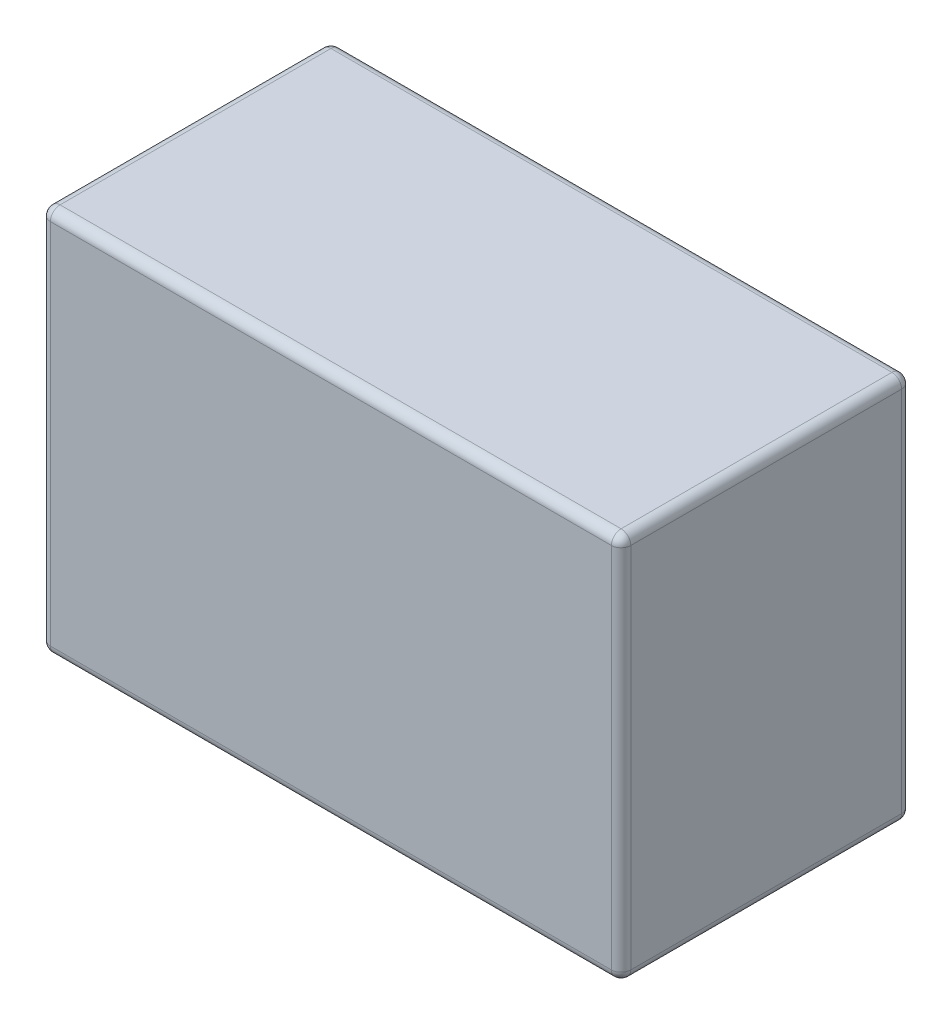
ISO-10303-21;
HEADER;
FILE_DESCRIPTION(('STEP AP214'),'2;1');
FILE_NAME('part.step','',(''),(''),'','','');
FILE_SCHEMA(('AUTOMOTIVE_DESIGN { 1 0 10303 214 1 1 1 1 }'));
ENDSEC;
DATA;
#1=APPLICATION_CONTEXT('core data for automotive mechanical design processes');
#2=APPLICATION_PROTOCOL_DEFINITION('international standard','automotive_design',2000,#1);
#3=PRODUCT_CONTEXT('',#1,'mechanical');
#4=PRODUCT('Part','Part','',(#3));
#5=PRODUCT_RELATED_PRODUCT_CATEGORY('part','',(#4));
#6=PRODUCT_DEFINITION_FORMATION('','',#4);
#7=PRODUCT_DEFINITION_CONTEXT('part definition',#1,'design');
#8=PRODUCT_DEFINITION('design','',#6,#7);
#9=PRODUCT_DEFINITION_SHAPE('','',#8);
#10=(LENGTH_UNIT() NAMED_UNIT(*) SI_UNIT(.MILLI.,.METRE.));
#11=(NAMED_UNIT(*) PLANE_ANGLE_UNIT() SI_UNIT($,.RADIAN.));
#12=(NAMED_UNIT(*) SI_UNIT($,.STERADIAN.) SOLID_ANGLE_UNIT());
#13=UNCERTAINTY_MEASURE_WITH_UNIT(LENGTH_MEASURE(1.E-05),#10,'distance_accuracy_value','');
#14=(GEOMETRIC_REPRESENTATION_CONTEXT(3) GLOBAL_UNCERTAINTY_ASSIGNED_CONTEXT((#13)) GLOBAL_UNIT_ASSIGNED_CONTEXT((#10,
#11,#12)) REPRESENTATION_CONTEXT('',''));
#15=CARTESIAN_POINT('',(0.,0.,0.));
#16=DIRECTION('',(0.,0.,1.));
#17=DIRECTION('',(1.,0.,0.));
#18=AXIS2_PLACEMENT_3D('',#15,#16,#17);
#19=CARTESIAN_POINT('',(29.,19.,29.));
#20=DIRECTION('',(0.,0.,-1.));
#21=DIRECTION('',(1.,0.,0.));
#22=AXIS2_PLACEMENT_3D('',#19,#20,#21);
#23=SPHERICAL_SURFACE('',#22,1.);
#24=CARTESIAN_POINT('',(29.,19.,29.));
#25=DIRECTION('',(0.,0.,1.));
#26=DIRECTION('',(1.,0.,0.));
#27=AXIS2_PLACEMENT_3D('',#24,#25,#26);
#28=CIRCLE('',#27,1.);
#29=CARTESIAN_POINT('',(30.,19.,29.));
#30=VERTEX_POINT('',#29);
#31=CARTESIAN_POINT('',(29.,20.,29.));
#32=VERTEX_POINT('',#31);
#33=EDGE_CURVE('E10',#30,#32,#28,.T.);
#34=ORIENTED_EDGE('',*,*,#33,.T.);
#35=CARTESIAN_POINT('',(29.,19.,29.));
#36=DIRECTION('',(-1.,0.,0.));
#37=DIRECTION('',(0.,1.,0.));
#38=AXIS2_PLACEMENT_3D('',#35,#36,#37);
#39=CIRCLE('',#38,1.);
#40=CARTESIAN_POINT('',(29.,19.,30.));
#41=VERTEX_POINT('',#40);
#42=EDGE_CURVE('E291',#41,#32,#39,.T.);
#43=ORIENTED_EDGE('',*,*,#42,.F.);
#44=CARTESIAN_POINT('',(29.,19.,29.));
#45=DIRECTION('',(0.,1.,0.));
#46=DIRECTION('',(1.,0.,0.));
#47=AXIS2_PLACEMENT_3D('',#44,#45,#46);
#48=CIRCLE('',#47,1.);
#49=EDGE_CURVE('E194',#41,#30,#48,.T.);
#50=ORIENTED_EDGE('',*,*,#49,.T.);
#51=EDGE_LOOP('',(#34,#43,#50));
#52=FACE_BOUND('',#51,.T.);
#53=ADVANCED_FACE('F16',(#52),#23,.T.);
#54=CARTESIAN_POINT('',(29.,19.,1.));
#55=DIRECTION('',(0.,0.,1.));
#56=DIRECTION('',(1.,0.,0.));
#57=AXIS2_PLACEMENT_3D('',#54,#55,#56);
#58=SPHERICAL_SURFACE('',#57,1.);
#59=CARTESIAN_POINT('',(29.,19.,1.));
#60=DIRECTION('',(0.,-1.,0.));
#61=DIRECTION('',(1.,0.,0.));
#62=AXIS2_PLACEMENT_3D('',#59,#60,#61);
#63=CIRCLE('',#62,1.);
#64=CARTESIAN_POINT('',(29.,19.,0.));
#65=VERTEX_POINT('',#64);
#66=CARTESIAN_POINT('',(30.,19.,1.));
#67=VERTEX_POINT('',#66);
#68=EDGE_CURVE('E185',#65,#67,#63,.T.);
#69=ORIENTED_EDGE('',*,*,#68,.F.);
#70=CARTESIAN_POINT('',(29.,19.,1.));
#71=DIRECTION('',(1.,0.,0.));
#72=DIRECTION('',(0.,1.,0.));
#73=AXIS2_PLACEMENT_3D('',#70,#71,#72);
#74=CIRCLE('',#73,1.);
#75=CARTESIAN_POINT('',(29.,20.,1.));
#76=VERTEX_POINT('',#75);
#77=EDGE_CURVE('E265',#65,#76,#74,.T.);
#78=ORIENTED_EDGE('',*,*,#77,.T.);
#79=CARTESIAN_POINT('',(29.,19.,1.));
#80=DIRECTION('',(0.,0.,1.));
#81=DIRECTION('',(1.,0.,0.));
#82=AXIS2_PLACEMENT_3D('',#79,#80,#81);
#83=CIRCLE('',#82,1.);
#84=EDGE_CURVE('E19',#67,#76,#83,.T.);
#85=ORIENTED_EDGE('',*,*,#84,.F.);
#86=EDGE_LOOP('',(#69,#78,#85));
#87=FACE_BOUND('',#86,.T.);
#88=ADVANCED_FACE('F335',(#87),#58,.T.);
#89=CARTESIAN_POINT('',(30.,20.,0.));
#90=DIRECTION('',(0.,-1.,0.));
#91=DIRECTION('',(0.,0.,-1.));
#92=AXIS2_PLACEMENT_3D('',#89,#90,#91);
#93=PLANE('',#92);
#94=DIRECTION('',(-1.,0.,0.));
#95=VECTOR('',#94,1.);
#96=CARTESIAN_POINT('',(30.,20.,1.));
#97=LINE('',#96,#95);
#98=CARTESIAN_POINT('',(-29.,20.,1.));
#99=VERTEX_POINT('',#98);
#100=EDGE_CURVE('E278',#76,#99,#97,.T.);
#101=ORIENTED_EDGE('',*,*,#100,.T.);
#102=DIRECTION('',(0.,0.,1.));
#103=VECTOR('',#102,1.);
#104=CARTESIAN_POINT('',(-29.,20.,0.));
#105=LINE('',#104,#103);
#106=CARTESIAN_POINT('',(-29.,20.,29.));
#107=VERTEX_POINT('',#106);
#108=EDGE_CURVE('E308',#99,#107,#105,.T.);
#109=ORIENTED_EDGE('',*,*,#108,.T.);
#110=DIRECTION('',(-1.,0.,0.));
#111=VECTOR('',#110,1.);
#112=CARTESIAN_POINT('',(30.,20.,29.));
#113=LINE('',#112,#111);
#114=EDGE_CURVE('E189',#32,#107,#113,.T.);
#115=ORIENTED_EDGE('',*,*,#114,.F.);
#116=DIRECTION('',(0.,0.,1.));
#117=VECTOR('',#116,1.);
#118=CARTESIAN_POINT('',(29.,20.,0.));
#119=LINE('',#118,#117);
#120=EDGE_CURVE('E25',#76,#32,#119,.T.);
#121=ORIENTED_EDGE('',*,*,#120,.F.);
#122=EDGE_LOOP('',(#101,#109,#115,#121));
#123=FACE_BOUND('',#122,.T.);
#124=ADVANCED_FACE('F354',(#123),#93,.F.);
#125=CARTESIAN_POINT('',(-29.,19.,29.));
#126=DIRECTION('',(0.,0.,-1.));
#127=DIRECTION('',(0.,1.,0.));
#128=AXIS2_PLACEMENT_3D('',#125,#126,#127);
#129=SPHERICAL_SURFACE('',#128,1.);
#130=CARTESIAN_POINT('',(-29.,19.,29.));
#131=DIRECTION('',(0.,0.,1.));
#132=DIRECTION('',(0.,1.,0.));
#133=AXIS2_PLACEMENT_3D('',#130,#131,#132);
#134=CIRCLE('',#133,1.);
#135=CARTESIAN_POINT('',(-30.,19.,29.));
#136=VERTEX_POINT('',#135);
#137=EDGE_CURVE('E183',#107,#136,#134,.T.);
#138=ORIENTED_EDGE('',*,*,#137,.T.);
#139=CARTESIAN_POINT('',(-29.,19.,29.));
#140=DIRECTION('',(0.,-1.,0.));
#141=DIRECTION('',(-1.,0.,0.));
#142=AXIS2_PLACEMENT_3D('',#139,#140,#141);
#143=CIRCLE('',#142,1.);
#144=CARTESIAN_POINT('',(-29.,19.,30.));
#145=VERTEX_POINT('',#144);
#146=EDGE_CURVE('E304',#145,#136,#143,.T.);
#147=ORIENTED_EDGE('',*,*,#146,.F.);
#148=CARTESIAN_POINT('',(-29.,19.,29.));
#149=DIRECTION('',(-1.,0.,0.));
#150=DIRECTION('',(0.,1.,0.));
#151=AXIS2_PLACEMENT_3D('',#148,#149,#150);
#152=CIRCLE('',#151,1.);
#153=EDGE_CURVE('E193',#145,#107,#152,.T.);
#154=ORIENTED_EDGE('',*,*,#153,.T.);
#155=EDGE_LOOP('',(#138,#147,#154));
#156=FACE_BOUND('',#155,.T.);
#157=ADVANCED_FACE('F359',(#156),#129,.T.);
#158=CARTESIAN_POINT('',(-29.,19.,1.));
#159=DIRECTION('',(0.,0.,1.));
#160=DIRECTION('',(0.,1.,0.));
#161=AXIS2_PLACEMENT_3D('',#158,#159,#160);
#162=SPHERICAL_SURFACE('',#161,1.);
#163=CARTESIAN_POINT('',(-29.,19.,1.));
#164=DIRECTION('',(1.,0.,0.));
#165=DIRECTION('',(0.,1.,0.));
#166=AXIS2_PLACEMENT_3D('',#163,#164,#165);
#167=CIRCLE('',#166,1.);
#168=CARTESIAN_POINT('',(-29.,19.,0.));
#169=VERTEX_POINT('',#168);
#170=EDGE_CURVE('E281',#169,#99,#167,.T.);
#171=ORIENTED_EDGE('',*,*,#170,.F.);
#172=CARTESIAN_POINT('',(-29.,19.,1.));
#173=DIRECTION('',(0.,1.,0.));
#174=DIRECTION('',(-1.,0.,0.));
#175=AXIS2_PLACEMENT_3D('',#172,#173,#174);
#176=CIRCLE('',#175,1.);
#177=CARTESIAN_POINT('',(-30.,19.,1.));
#178=VERTEX_POINT('',#177);
#179=EDGE_CURVE('E200',#169,#178,#176,.T.);
#180=ORIENTED_EDGE('',*,*,#179,.T.);
#181=CARTESIAN_POINT('',(-29.,19.,1.));
#182=DIRECTION('',(0.,0.,1.));
#183=DIRECTION('',(0.,1.,0.));
#184=AXIS2_PLACEMENT_3D('',#181,#182,#183);
#185=CIRCLE('',#184,1.);
#186=EDGE_CURVE('E186',#99,#178,#185,.T.);
#187=ORIENTED_EDGE('',*,*,#186,.F.);
#188=EDGE_LOOP('',(#171,#180,#187));
#189=FACE_BOUND('',#188,.T.);
#190=ADVANCED_FACE('F349',(#189),#162,.T.);
#191=CARTESIAN_POINT('',(29.,19.,0.));
#192=DIRECTION('',(0.,0.,1.));
#193=DIRECTION('',(1.,0.,0.));
#194=AXIS2_PLACEMENT_3D('',#191,#192,#193);
#195=CYLINDRICAL_SURFACE('',#194,1.);
#196=DIRECTION('',(0.,0.,1.));
#197=VECTOR('',#196,1.);
#198=CARTESIAN_POINT('',(30.,19.,0.));
#199=LINE('',#198,#197);
#200=EDGE_CURVE('E201',#67,#30,#199,.T.);
#201=ORIENTED_EDGE('',*,*,#200,.F.);
#202=ORIENTED_EDGE('',*,*,#84,.T.);
#203=ORIENTED_EDGE('',*,*,#120,.T.);
#204=ORIENTED_EDGE('',*,*,#33,.F.);
#205=EDGE_LOOP('',(#201,#202,#203,#204));
#206=FACE_BOUND('',#205,.T.);
#207=ADVANCED_FACE('F329',(#206),#195,.T.);
#208=CARTESIAN_POINT('',(30.,19.,29.));
#209=DIRECTION('',(-1.,0.,0.));
#210=DIRECTION('',(0.,1.,0.));
#211=AXIS2_PLACEMENT_3D('',#208,#209,#210);
#212=CYLINDRICAL_SURFACE('',#211,1.);
#213=ORIENTED_EDGE('',*,*,#114,.T.);
#214=ORIENTED_EDGE('',*,*,#153,.F.);
#215=DIRECTION('',(-1.,0.,0.));
#216=VECTOR('',#215,1.);
#217=CARTESIAN_POINT('',(30.,19.,30.));
#218=LINE('',#217,#216);
#219=EDGE_CURVE('E272',#41,#145,#218,.T.);
#220=ORIENTED_EDGE('',*,*,#219,.F.);
#221=ORIENTED_EDGE('',*,*,#42,.T.);
#222=EDGE_LOOP('',(#213,#214,#220,#221));
#223=FACE_BOUND('',#222,.T.);
#224=ADVANCED_FACE('F355',(#223),#212,.T.);
#225=CARTESIAN_POINT('',(29.,-20.,29.));
#226=DIRECTION('',(0.,1.,0.));
#227=DIRECTION('',(1.,0.,0.));
#228=AXIS2_PLACEMENT_3D('',#225,#226,#227);
#229=CYLINDRICAL_SURFACE('',#228,1.);
#230=DIRECTION('',(0.,1.,0.));
#231=VECTOR('',#230,1.);
#232=CARTESIAN_POINT('',(30.,-20.,29.));
#233=LINE('',#232,#231);
#234=CARTESIAN_POINT('',(30.,-19.,29.));
#235=VERTEX_POINT('',#234);
#236=EDGE_CURVE('E197',#235,#30,#233,.T.);
#237=ORIENTED_EDGE('',*,*,#236,.T.);
#238=ORIENTED_EDGE('',*,*,#49,.F.);
#239=DIRECTION('',(0.,1.,0.));
#240=VECTOR('',#239,1.);
#241=CARTESIAN_POINT('',(29.,-20.,30.));
#242=LINE('',#241,#240);
#243=CARTESIAN_POINT('',(29.,-19.,30.));
#244=VERTEX_POINT('',#243);
#245=EDGE_CURVE('E269',#244,#41,#242,.T.);
#246=ORIENTED_EDGE('',*,*,#245,.F.);
#247=CARTESIAN_POINT('',(29.,-19.,29.));
#248=DIRECTION('',(0.,1.,0.));
#249=DIRECTION('',(1.,0.,0.));
#250=AXIS2_PLACEMENT_3D('',#247,#248,#249);
#251=CIRCLE('',#250,1.);
#252=EDGE_CURVE('E284',#244,#235,#251,.T.);
#253=ORIENTED_EDGE('',*,*,#252,.T.);
#254=EDGE_LOOP('',(#237,#238,#246,#253));
#255=FACE_BOUND('',#254,.T.);
#256=ADVANCED_FACE('F371',(#255),#229,.T.);
#257=CARTESIAN_POINT('',(30.,19.,1.));
#258=DIRECTION('',(-1.,0.,0.));
#259=DIRECTION('',(0.,1.,0.));
#260=AXIS2_PLACEMENT_3D('',#257,#258,#259);
#261=CYLINDRICAL_SURFACE('',#260,1.);
#262=ORIENTED_EDGE('',*,*,#77,.F.);
#263=DIRECTION('',(-1.,0.,0.));
#264=VECTOR('',#263,1.);
#265=CARTESIAN_POINT('',(30.,19.,0.));
#266=LINE('',#265,#264);
#267=EDGE_CURVE('E208',#65,#169,#266,.T.);
#268=ORIENTED_EDGE('',*,*,#267,.T.);
#269=ORIENTED_EDGE('',*,*,#170,.T.);
#270=ORIENTED_EDGE('',*,*,#100,.F.);
#271=EDGE_LOOP('',(#262,#268,#269,#270));
#272=FACE_BOUND('',#271,.T.);
#273=ADVANCED_FACE('F333',(#272),#261,.T.);
#274=CARTESIAN_POINT('',(29.,-20.,1.));
#275=DIRECTION('',(0.,1.,0.));
#276=DIRECTION('',(1.,0.,0.));
#277=AXIS2_PLACEMENT_3D('',#274,#275,#276);
#278=CYLINDRICAL_SURFACE('',#277,1.);
#279=CARTESIAN_POINT('',(29.,-19.,1.));
#280=DIRECTION('',(0.,-1.,0.));
#281=DIRECTION('',(1.,0.,0.));
#282=AXIS2_PLACEMENT_3D('',#279,#280,#281);
#283=CIRCLE('',#282,1.);
#284=CARTESIAN_POINT('',(29.,-19.,0.));
#285=VERTEX_POINT('',#284);
#286=CARTESIAN_POINT('',(30.,-19.,1.));
#287=VERTEX_POINT('',#286);
#288=EDGE_CURVE('E207',#285,#287,#283,.T.);
#289=ORIENTED_EDGE('',*,*,#288,.F.);
#290=DIRECTION('',(0.,1.,0.));
#291=VECTOR('',#290,1.);
#292=CARTESIAN_POINT('',(29.,-20.,0.));
#293=LINE('',#292,#291);
#294=EDGE_CURVE('E203',#285,#65,#293,.T.);
#295=ORIENTED_EDGE('',*,*,#294,.T.);
#296=ORIENTED_EDGE('',*,*,#68,.T.);
#297=DIRECTION('',(0.,1.,0.));
#298=VECTOR('',#297,1.);
#299=CARTESIAN_POINT('',(30.,-20.,1.));
#300=LINE('',#299,#298);
#301=EDGE_CURVE('E288',#287,#67,#300,.T.);
#302=ORIENTED_EDGE('',*,*,#301,.F.);
#303=EDGE_LOOP('',(#289,#295,#296,#302));
#304=FACE_BOUND('',#303,.T.);
#305=ADVANCED_FACE('F339',(#304),#278,.T.);
#306=CARTESIAN_POINT('',(-29.,19.,0.));
#307=DIRECTION('',(0.,0.,1.));
#308=DIRECTION('',(0.,1.,0.));
#309=AXIS2_PLACEMENT_3D('',#306,#307,#308);
#310=CYLINDRICAL_SURFACE('',#309,1.);
#311=ORIENTED_EDGE('',*,*,#108,.F.);
#312=ORIENTED_EDGE('',*,*,#186,.T.);
#313=DIRECTION('',(0.,0.,1.));
#314=VECTOR('',#313,1.);
#315=CARTESIAN_POINT('',(-30.,19.,0.));
#316=LINE('',#315,#314);
#317=EDGE_CURVE('E251',#178,#136,#316,.T.);
#318=ORIENTED_EDGE('',*,*,#317,.T.);
#319=ORIENTED_EDGE('',*,*,#137,.F.);
#320=EDGE_LOOP('',(#311,#312,#318,#319));
#321=FACE_BOUND('',#320,.T.);
#322=ADVANCED_FACE('F353',(#321),#310,.T.);
#323=CARTESIAN_POINT('',(-29.,20.,29.));
#324=DIRECTION('',(0.,-1.,0.));
#325=DIRECTION('',(-1.,0.,0.));
#326=AXIS2_PLACEMENT_3D('',#323,#324,#325);
#327=CYLINDRICAL_SURFACE('',#326,1.);
#328=DIRECTION('',(0.,-1.,0.));
#329=VECTOR('',#328,1.);
#330=CARTESIAN_POINT('',(-30.,20.,29.));
#331=LINE('',#330,#329);
#332=CARTESIAN_POINT('',(-30.,-19.,29.));
#333=VERTEX_POINT('',#332);
#334=EDGE_CURVE('E239',#136,#333,#331,.T.);
#335=ORIENTED_EDGE('',*,*,#334,.T.);
#336=CARTESIAN_POINT('',(-29.,-19.,29.));
#337=DIRECTION('',(0.,-1.,0.));
#338=DIRECTION('',(-1.,0.,0.));
#339=AXIS2_PLACEMENT_3D('',#336,#337,#338);
#340=CIRCLE('',#339,1.);
#341=CARTESIAN_POINT('',(-29.,-19.,30.));
#342=VERTEX_POINT('',#341);
#343=EDGE_CURVE('E235',#342,#333,#340,.T.);
#344=ORIENTED_EDGE('',*,*,#343,.F.);
#345=DIRECTION('',(0.,-1.,0.));
#346=VECTOR('',#345,1.);
#347=CARTESIAN_POINT('',(-29.,20.,30.));
#348=LINE('',#347,#346);
#349=EDGE_CURVE('E277',#145,#342,#348,.T.);
#350=ORIENTED_EDGE('',*,*,#349,.F.);
#351=ORIENTED_EDGE('',*,*,#146,.T.);
#352=EDGE_LOOP('',(#335,#344,#350,#351));
#353=FACE_BOUND('',#352,.T.);
#354=ADVANCED_FACE('F362',(#353),#327,.T.);
#355=CARTESIAN_POINT('',(-29.,20.,1.));
#356=DIRECTION('',(0.,-1.,0.));
#357=DIRECTION('',(-1.,0.,0.));
#358=AXIS2_PLACEMENT_3D('',#355,#356,#357);
#359=CYLINDRICAL_SURFACE('',#358,1.);
#360=ORIENTED_EDGE('',*,*,#179,.F.);
#361=DIRECTION('',(0.,-1.,0.));
#362=VECTOR('',#361,1.);
#363=CARTESIAN_POINT('',(-29.,20.,0.));
#364=LINE('',#363,#362);
#365=CARTESIAN_POINT('',(-29.,-19.,0.));
#366=VERTEX_POINT('',#365);
#367=EDGE_CURVE('E250',#169,#366,#364,.T.);
#368=ORIENTED_EDGE('',*,*,#367,.T.);
#369=CARTESIAN_POINT('',(-29.,-19.,1.));
#370=DIRECTION('',(0.,1.,0.));
#371=DIRECTION('',(-1.,0.,0.));
#372=AXIS2_PLACEMENT_3D('',#369,#370,#371);
#373=CIRCLE('',#372,1.);
#374=CARTESIAN_POINT('',(-30.,-19.,1.));
#375=VERTEX_POINT('',#374);
#376=EDGE_CURVE('E141',#366,#375,#373,.T.);
#377=ORIENTED_EDGE('',*,*,#376,.T.);
#378=DIRECTION('',(0.,-1.,0.));
#379=VECTOR('',#378,1.);
#380=CARTESIAN_POINT('',(-30.,20.,1.));
#381=LINE('',#380,#379);
#382=EDGE_CURVE('E247',#178,#375,#381,.T.);
#383=ORIENTED_EDGE('',*,*,#382,.F.);
#384=EDGE_LOOP('',(#360,#368,#377,#383));
#385=FACE_BOUND('',#384,.T.);
#386=ADVANCED_FACE('F345',(#385),#359,.T.);
#387=CARTESIAN_POINT('',(30.,-20.,0.));
#388=DIRECTION('',(-1.,0.,0.));
#389=DIRECTION('',(0.,0.,1.));
#390=AXIS2_PLACEMENT_3D('',#387,#388,#389);
#391=PLANE('',#390);
#392=ORIENTED_EDGE('',*,*,#301,.T.);
#393=ORIENTED_EDGE('',*,*,#200,.T.);
#394=ORIENTED_EDGE('',*,*,#236,.F.);
#395=DIRECTION('',(0.,0.,1.));
#396=VECTOR('',#395,1.);
#397=CARTESIAN_POINT('',(30.,-19.,0.));
#398=LINE('',#397,#396);
#399=EDGE_CURVE('E222',#287,#235,#398,.T.);
#400=ORIENTED_EDGE('',*,*,#399,.F.);
#401=EDGE_LOOP('',(#392,#393,#394,#400));
#402=FACE_BOUND('',#401,.T.);
#403=ADVANCED_FACE('F396',(#402),#391,.F.);
#404=CARTESIAN_POINT('',(29.,-19.,29.));
#405=DIRECTION('',(0.,0.,-1.));
#406=DIRECTION('',(0.,-1.,0.));
#407=AXIS2_PLACEMENT_3D('',#404,#405,#406);
#408=SPHERICAL_SURFACE('',#407,1.);
#409=CARTESIAN_POINT('',(29.,-19.,29.));
#410=DIRECTION('',(0.,0.,1.));
#411=DIRECTION('',(0.,-1.,0.));
#412=AXIS2_PLACEMENT_3D('',#409,#410,#411);
#413=CIRCLE('',#412,1.);
#414=CARTESIAN_POINT('',(29.,-20.,29.));
#415=VERTEX_POINT('',#414);
#416=EDGE_CURVE('E218',#415,#235,#413,.T.);
#417=ORIENTED_EDGE('',*,*,#416,.T.);
#418=ORIENTED_EDGE('',*,*,#252,.F.);
#419=CARTESIAN_POINT('',(29.,-19.,29.));
#420=DIRECTION('',(1.,0.,0.));
#421=DIRECTION('',(0.,-1.,0.));
#422=AXIS2_PLACEMENT_3D('',#419,#420,#421);
#423=CIRCLE('',#422,1.);
#424=EDGE_CURVE('E217',#244,#415,#423,.T.);
#425=ORIENTED_EDGE('',*,*,#424,.T.);
#426=EDGE_LOOP('',(#417,#418,#425));
#427=FACE_BOUND('',#426,.T.);
#428=ADVANCED_FACE('F399',(#427),#408,.T.);
#429=CARTESIAN_POINT('',(0.,0.,30.));
#430=DIRECTION('',(0.,0.,1.));
#431=DIRECTION('',(1.,0.,0.));
#432=AXIS2_PLACEMENT_3D('',#429,#430,#431);
#433=PLANE('',#432);
#434=DIRECTION('',(1.,0.,0.));
#435=VECTOR('',#434,1.);
#436=CARTESIAN_POINT('',(-30.,-19.,30.));
#437=LINE('',#436,#435);
#438=EDGE_CURVE('E230',#342,#244,#437,.T.);
#439=ORIENTED_EDGE('',*,*,#438,.T.);
#440=ORIENTED_EDGE('',*,*,#245,.T.);
#441=ORIENTED_EDGE('',*,*,#219,.T.);
#442=ORIENTED_EDGE('',*,*,#349,.T.);
#443=EDGE_LOOP('',(#439,#440,#441,#442));
#444=FACE_BOUND('',#443,.T.);
#445=ADVANCED_FACE('F365',(#444),#433,.T.);
#446=CARTESIAN_POINT('',(29.,-19.,1.));
#447=DIRECTION('',(0.,0.,1.));
#448=DIRECTION('',(0.,-1.,0.));
#449=AXIS2_PLACEMENT_3D('',#446,#447,#448);
#450=SPHERICAL_SURFACE('',#449,1.);
#451=CARTESIAN_POINT('',(29.,-19.,1.));
#452=DIRECTION('',(-1.,0.,0.));
#453=DIRECTION('',(0.,-1.,0.));
#454=AXIS2_PLACEMENT_3D('',#451,#452,#453);
#455=CIRCLE('',#454,1.);
#456=CARTESIAN_POINT('',(29.,-20.,1.));
#457=VERTEX_POINT('',#456);
#458=EDGE_CURVE('E173',#285,#457,#455,.T.);
#459=ORIENTED_EDGE('',*,*,#458,.F.);
#460=ORIENTED_EDGE('',*,*,#288,.T.);
#461=CARTESIAN_POINT('',(29.,-19.,1.));
#462=DIRECTION('',(0.,0.,1.));
#463=DIRECTION('',(0.,-1.,0.));
#464=AXIS2_PLACEMENT_3D('',#461,#462,#463);
#465=CIRCLE('',#464,1.);
#466=EDGE_CURVE('E225',#457,#287,#465,.T.);
#467=ORIENTED_EDGE('',*,*,#466,.F.);
#468=EDGE_LOOP('',(#459,#460,#467));
#469=FACE_BOUND('',#468,.T.);
#470=ADVANCED_FACE('F406',(#469),#450,.T.);
#471=CARTESIAN_POINT('',(0.,0.,0.));
#472=DIRECTION('',(0.,0.,1.));
#473=DIRECTION('',(1.,0.,0.));
#474=AXIS2_PLACEMENT_3D('',#471,#472,#473);
#475=PLANE('',#474);
#476=ORIENTED_EDGE('',*,*,#367,.F.);
#477=ORIENTED_EDGE('',*,*,#267,.F.);
#478=ORIENTED_EDGE('',*,*,#294,.F.);
#479=DIRECTION('',(1.,0.,0.));
#480=VECTOR('',#479,1.);
#481=CARTESIAN_POINT('',(-30.,-19.,0.));
#482=LINE('',#481,#480);
#483=EDGE_CURVE('E147',#366,#285,#482,.T.);
#484=ORIENTED_EDGE('',*,*,#483,.F.);
#485=EDGE_LOOP('',(#476,#477,#478,#484));
#486=FACE_BOUND('',#485,.T.);
#487=ADVANCED_FACE('F342',(#486),#475,.F.);
#488=CARTESIAN_POINT('',(-30.,20.,0.));
#489=DIRECTION('',(1.,0.,0.));
#490=DIRECTION('',(0.,1.,0.));
#491=AXIS2_PLACEMENT_3D('',#488,#489,#490);
#492=PLANE('',#491);
#493=ORIENTED_EDGE('',*,*,#334,.F.);
#494=ORIENTED_EDGE('',*,*,#317,.F.);
#495=ORIENTED_EDGE('',*,*,#382,.T.);
#496=DIRECTION('',(0.,0.,1.));
#497=VECTOR('',#496,1.);
#498=CARTESIAN_POINT('',(-30.,-19.,0.));
#499=LINE('',#498,#497);
#500=EDGE_CURVE('E157',#375,#333,#499,.T.);
#501=ORIENTED_EDGE('',*,*,#500,.T.);
#502=EDGE_LOOP('',(#493,#494,#495,#501));
#503=FACE_BOUND('',#502,.T.);
#504=ADVANCED_FACE('F410',(#503),#492,.F.);
#505=CARTESIAN_POINT('',(-29.,-19.,29.));
#506=DIRECTION('',(0.,0.,-1.));
#507=DIRECTION('',(0.,-1.,0.));
#508=AXIS2_PLACEMENT_3D('',#505,#506,#507);
#509=SPHERICAL_SURFACE('',#508,1.);
#510=CARTESIAN_POINT('',(-29.,-19.,29.));
#511=DIRECTION('',(1.,0.,0.));
#512=DIRECTION('',(0.,-1.,0.));
#513=AXIS2_PLACEMENT_3D('',#510,#511,#512);
#514=CIRCLE('',#513,1.);
#515=CARTESIAN_POINT('',(-29.,-20.,29.));
#516=VERTEX_POINT('',#515);
#517=EDGE_CURVE('E234',#342,#516,#514,.T.);
#518=ORIENTED_EDGE('',*,*,#517,.F.);
#519=ORIENTED_EDGE('',*,*,#343,.T.);
#520=CARTESIAN_POINT('',(-29.,-19.,29.));
#521=DIRECTION('',(0.,0.,-1.));
#522=DIRECTION('',(0.,-1.,0.));
#523=AXIS2_PLACEMENT_3D('',#520,#521,#522);
#524=CIRCLE('',#523,1.);
#525=EDGE_CURVE('E168',#516,#333,#524,.T.);
#526=ORIENTED_EDGE('',*,*,#525,.F.);
#527=EDGE_LOOP('',(#518,#519,#526));
#528=FACE_BOUND('',#527,.T.);
#529=ADVANCED_FACE('F413',(#528),#509,.T.);
#530=CARTESIAN_POINT('',(-29.,-19.,1.));
#531=DIRECTION('',(0.,0.,1.));
#532=DIRECTION('',(0.,-1.,0.));
#533=AXIS2_PLACEMENT_3D('',#530,#531,#532);
#534=SPHERICAL_SURFACE('',#533,1.);
#535=CARTESIAN_POINT('',(-29.,-19.,1.));
#536=DIRECTION('',(0.,0.,-1.));
#537=DIRECTION('',(0.,-1.,0.));
#538=AXIS2_PLACEMENT_3D('',#535,#536,#537);
#539=CIRCLE('',#538,1.);
#540=CARTESIAN_POINT('',(-29.,-20.,1.));
#541=VERTEX_POINT('',#540);
#542=EDGE_CURVE('E138',#541,#375,#539,.T.);
#543=ORIENTED_EDGE('',*,*,#542,.T.);
#544=ORIENTED_EDGE('',*,*,#376,.F.);
#545=CARTESIAN_POINT('',(-29.,-19.,1.));
#546=DIRECTION('',(-1.,0.,0.));
#547=DIRECTION('',(0.,-1.,0.));
#548=AXIS2_PLACEMENT_3D('',#545,#546,#547);
#549=CIRCLE('',#548,1.);
#550=EDGE_CURVE('E135',#366,#541,#549,.T.);
#551=ORIENTED_EDGE('',*,*,#550,.T.);
#552=EDGE_LOOP('',(#543,#544,#551));
#553=FACE_BOUND('',#552,.T.);
#554=ADVANCED_FACE('F137',(#553),#534,.T.);
#555=CARTESIAN_POINT('',(29.,-19.,0.));
#556=DIRECTION('',(0.,0.,1.));
#557=DIRECTION('',(0.,-1.,0.));
#558=AXIS2_PLACEMENT_3D('',#555,#556,#557);
#559=CYLINDRICAL_SURFACE('',#558,1.);
#560=DIRECTION('',(0.,0.,1.));
#561=VECTOR('',#560,1.);
#562=CARTESIAN_POINT('',(29.,-20.,0.));
#563=LINE('',#562,#561);
#564=EDGE_CURVE('E176',#457,#415,#563,.T.);
#565=ORIENTED_EDGE('',*,*,#564,.F.);
#566=ORIENTED_EDGE('',*,*,#466,.T.);
#567=ORIENTED_EDGE('',*,*,#399,.T.);
#568=ORIENTED_EDGE('',*,*,#416,.F.);
#569=EDGE_LOOP('',(#565,#566,#567,#568));
#570=FACE_BOUND('',#569,.T.);
#571=ADVANCED_FACE('F420',(#570),#559,.T.);
#572=CARTESIAN_POINT('',(-30.,-19.,29.));
#573=DIRECTION('',(1.,0.,0.));
#574=DIRECTION('',(0.,-1.,0.));
#575=AXIS2_PLACEMENT_3D('',#572,#573,#574);
#576=CYLINDRICAL_SURFACE('',#575,1.);
#577=DIRECTION('',(1.,0.,0.));
#578=VECTOR('',#577,1.);
#579=CARTESIAN_POINT('',(-30.,-20.,29.));
#580=LINE('',#579,#578);
#581=EDGE_CURVE('E166',#516,#415,#580,.T.);
#582=ORIENTED_EDGE('',*,*,#581,.T.);
#583=ORIENTED_EDGE('',*,*,#424,.F.);
#584=ORIENTED_EDGE('',*,*,#438,.F.);
#585=ORIENTED_EDGE('',*,*,#517,.T.);
#586=EDGE_LOOP('',(#582,#583,#584,#585));
#587=FACE_BOUND('',#586,.T.);
#588=ADVANCED_FACE('F423',(#587),#576,.T.);
#589=CARTESIAN_POINT('',(-30.,-19.,1.));
#590=DIRECTION('',(1.,0.,0.));
#591=DIRECTION('',(0.,-1.,0.));
#592=AXIS2_PLACEMENT_3D('',#589,#590,#591);
#593=CYLINDRICAL_SURFACE('',#592,1.);
#594=ORIENTED_EDGE('',*,*,#550,.F.);
#595=ORIENTED_EDGE('',*,*,#483,.T.);
#596=ORIENTED_EDGE('',*,*,#458,.T.);
#597=DIRECTION('',(1.,0.,0.));
#598=VECTOR('',#597,1.);
#599=CARTESIAN_POINT('',(-30.,-20.,1.));
#600=LINE('',#599,#598);
#601=EDGE_CURVE('E164',#541,#457,#600,.T.);
#602=ORIENTED_EDGE('',*,*,#601,.F.);
#603=EDGE_LOOP('',(#594,#595,#596,#602));
#604=FACE_BOUND('',#603,.T.);
#605=ADVANCED_FACE('F171',(#604),#593,.T.);
#606=CARTESIAN_POINT('',(-29.,-19.,0.));
#607=DIRECTION('',(0.,0.,1.));
#608=DIRECTION('',(0.,-1.,0.));
#609=AXIS2_PLACEMENT_3D('',#606,#607,#608);
#610=CYLINDRICAL_SURFACE('',#609,1.);
#611=ORIENTED_EDGE('',*,*,#525,.T.);
#612=ORIENTED_EDGE('',*,*,#500,.F.);
#613=ORIENTED_EDGE('',*,*,#542,.F.);
#614=DIRECTION('',(0.,0.,1.));
#615=VECTOR('',#614,1.);
#616=CARTESIAN_POINT('',(-29.,-20.,0.));
#617=LINE('',#616,#615);
#618=EDGE_CURVE('E154',#541,#516,#617,.T.);
#619=ORIENTED_EDGE('',*,*,#618,.T.);
#620=EDGE_LOOP('',(#611,#612,#613,#619));
#621=FACE_BOUND('',#620,.T.);
#622=ADVANCED_FACE('F153',(#621),#610,.T.);
#623=CARTESIAN_POINT('',(-30.,-20.,0.));
#624=DIRECTION('',(0.,1.,0.));
#625=DIRECTION('',(1.,0.,0.));
#626=AXIS2_PLACEMENT_3D('',#623,#624,#625);
#627=PLANE('',#626);
#628=ORIENTED_EDGE('',*,*,#601,.T.);
#629=ORIENTED_EDGE('',*,*,#564,.T.);
#630=ORIENTED_EDGE('',*,*,#581,.F.);
#631=ORIENTED_EDGE('',*,*,#618,.F.);
#632=EDGE_LOOP('',(#628,#629,#630,#631));
#633=FACE_BOUND('',#632,.T.);
#634=ADVANCED_FACE('F162',(#633),#627,.F.);
#635=CLOSED_SHELL('',(#53,#88,#124,#157,#190,#207,#224,#256,#273,#305,#322,#354,#386,#403,#428,
#445,#470,#487,#504,#529,#554,#571,#588,#605,#622,#634));
#636=MANIFOLD_SOLID_BREP('B1',#635);
#637=ADVANCED_BREP_SHAPE_REPRESENTATION('',(#18,#636),#14);
#638=SHAPE_DEFINITION_REPRESENTATION(#9,#637);
ENDSEC;
END-ISO-10303-21;
